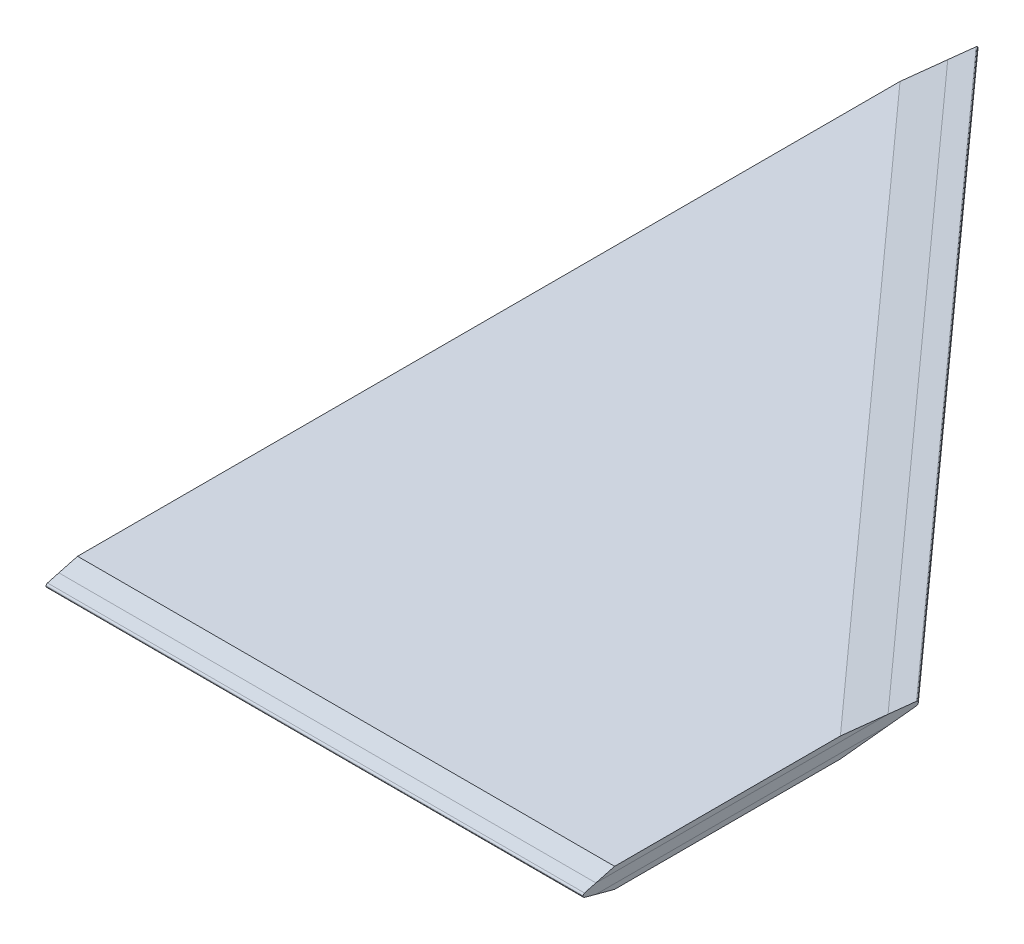
ISO-10303-21;
HEADER;
FILE_DESCRIPTION(('STEP AP214'),'2;1');
FILE_NAME('part.step','',(''),(''),'','','');
FILE_SCHEMA(('AUTOMOTIVE_DESIGN { 1 0 10303 214 1 1 1 1 }'));
ENDSEC;
DATA;
#1=APPLICATION_CONTEXT('core data for automotive mechanical design processes');
#2=APPLICATION_PROTOCOL_DEFINITION('international standard','automotive_design',2000,#1);
#3=PRODUCT_CONTEXT('',#1,'mechanical');
#4=PRODUCT('Part','Part','',(#3));
#5=PRODUCT_RELATED_PRODUCT_CATEGORY('part','',(#4));
#6=PRODUCT_DEFINITION_FORMATION('','',#4);
#7=PRODUCT_DEFINITION_CONTEXT('part definition',#1,'design');
#8=PRODUCT_DEFINITION('design','',#6,#7);
#9=PRODUCT_DEFINITION_SHAPE('','',#8);
#10=(LENGTH_UNIT() NAMED_UNIT(*) SI_UNIT(.MILLI.,.METRE.));
#11=(NAMED_UNIT(*) PLANE_ANGLE_UNIT() SI_UNIT($,.RADIAN.));
#12=(NAMED_UNIT(*) SI_UNIT($,.STERADIAN.) SOLID_ANGLE_UNIT());
#13=UNCERTAINTY_MEASURE_WITH_UNIT(LENGTH_MEASURE(1.E-05),#10,'distance_accuracy_value','');
#14=(GEOMETRIC_REPRESENTATION_CONTEXT(3) GLOBAL_UNCERTAINTY_ASSIGNED_CONTEXT((#13)) GLOBAL_UNIT_ASSIGNED_CONTEXT((#10,
#11,#12)) REPRESENTATION_CONTEXT('',''));
#15=CARTESIAN_POINT('',(0.,0.,0.));
#16=DIRECTION('',(0.,0.,1.));
#17=DIRECTION('',(1.,0.,0.));
#18=AXIS2_PLACEMENT_3D('',#15,#16,#17);
#19=CARTESIAN_POINT('',(171.45,1.4811576642539,-0.396875000000005));
#20=DIRECTION('',(0.,-0.965925826289068,0.258819045102523));
#21=DIRECTION('',(-1.,0.,0.));
#22=AXIS2_PLACEMENT_3D('',#19,#20,#21);
#23=PLANE('',#22);
#24=DIRECTION('',(0.,-0.258819045102523,-0.965925826289068));
#25=VECTOR('',#24,1.);
#26=CARTESIAN_POINT('',(0.,1.69384233574611,0.396875));
#27=LINE('',#26,#25);
#28=CARTESIAN_POINT('',(0.,0.974137100306443,-2.28910150513413));
#29=VERTEX_POINT('',#28);
#30=CARTESIAN_POINT('',(0.,0.,-5.92463065701555));
#31=VERTEX_POINT('',#30);
#32=EDGE_CURVE('P0_E126',#29,#31,#27,.T.);
#33=ORIENTED_EDGE('',*,*,#32,.T.);
#34=DIRECTION('',(-1.,0.,0.));
#35=VECTOR('',#34,1.);
#36=CARTESIAN_POINT('',(0.,0.,-5.92463065701556));
#37=LINE('',#36,#35);
#38=CARTESIAN_POINT('',(171.45,0.,-5.92463065701556));
#39=VERTEX_POINT('',#38);
#40=EDGE_CURVE('P0_E141',#39,#31,#37,.T.);
#41=ORIENTED_EDGE('',*,*,#40,.F.);
#42=DIRECTION('',(0.,0.258819045102523,0.965925826289068));
#43=VECTOR('',#42,1.);
#44=CARTESIAN_POINT('',(171.45,1.4811576642539,-0.396875000000005));
#45=LINE('',#44,#43);
#46=CARTESIAN_POINT('',(171.45,0.974137100306442,-2.28910150513413));
#47=VERTEX_POINT('',#46);
#48=EDGE_CURVE('P0_E154',#39,#47,#45,.T.);
#49=ORIENTED_EDGE('',*,*,#48,.T.);
#50=DIRECTION('',(-1.,0.,0.));
#51=VECTOR('',#50,1.);
#52=CARTESIAN_POINT('',(171.45,0.974137100306442,-2.28910150513413));
#53=LINE('',#52,#51);
#54=EDGE_CURVE('P0_E492',#47,#29,#53,.T.);
#55=ORIENTED_EDGE('',*,*,#54,.T.);
#56=EDGE_LOOP('',(#33,#41,#49,#55));
#57=FACE_BOUND('',#56,.T.);
#58=ADVANCED_FACE('P0_F17',(#57),#23,.T.);
#59=CARTESIAN_POINT('',(171.45,1.48115766425389,0.396875));
#60=DIRECTION('',(0.,0.965925826289068,0.258819045102523));
#61=DIRECTION('',(1.,0.,0.));
#62=AXIS2_PLACEMENT_3D('',#59,#60,#61);
#63=PLANE('',#62);
#64=DIRECTION('',(0.,-0.258819045102523,0.965925826289068));
#65=VECTOR('',#64,1.);
#66=CARTESIAN_POINT('',(0.,1.6938423357461,-0.396875));
#67=LINE('',#66,#65);
#68=CARTESIAN_POINT('',(0.,3.175,-5.92463065701556));
#69=VERTEX_POINT('',#68);
#70=CARTESIAN_POINT('',(0.,2.20086289969356,-2.28910150513413));
#71=VERTEX_POINT('',#70);
#72=EDGE_CURVE('P0_E157',#69,#71,#67,.T.);
#73=ORIENTED_EDGE('',*,*,#72,.T.);
#74=DIRECTION('',(-1.,0.,0.));
#75=VECTOR('',#74,1.);
#76=CARTESIAN_POINT('',(171.45,2.20086289969356,-2.28910150513413));
#77=LINE('',#76,#75);
#78=CARTESIAN_POINT('',(171.45,2.20086289969356,-2.28910150513413));
#79=VERTEX_POINT('',#78);
#80=EDGE_CURVE('P0_E11',#79,#71,#77,.T.);
#81=ORIENTED_EDGE('',*,*,#80,.F.);
#82=DIRECTION('',(0.,0.258819045102523,-0.965925826289068));
#83=VECTOR('',#82,1.);
#84=CARTESIAN_POINT('',(171.45,1.48115766425389,0.396875));
#85=LINE('',#84,#83);
#86=CARTESIAN_POINT('',(171.45,3.175,-5.92463065701556));
#87=VERTEX_POINT('',#86);
#88=EDGE_CURVE('P0_E137',#79,#87,#85,.T.);
#89=ORIENTED_EDGE('',*,*,#88,.T.);
#90=DIRECTION('',(-1.,0.,0.));
#91=VECTOR('',#90,1.);
#92=CARTESIAN_POINT('',(0.,3.175,-5.92463065701556));
#93=LINE('',#92,#91);
#94=EDGE_CURVE('P0_E522',#87,#69,#93,.T.);
#95=ORIENTED_EDGE('',*,*,#94,.T.);
#96=EDGE_LOOP('',(#73,#81,#89,#95));
#97=FACE_BOUND('',#96,.T.);
#98=ADVANCED_FACE('P0_F353',(#97),#63,.T.);
#99=CARTESIAN_POINT('',(171.45,1.5875,-2.45345159877422));
#100=DIRECTION('',(-1.,0.,0.));
#101=DIRECTION('',(0.,0.,1.));
#102=AXIS2_PLACEMENT_3D('',#99,#100,#101);
#103=CYLINDRICAL_SURFACE('',#102,0.635);
#104=DIRECTION('',(-1.,0.,0.));
#105=VECTOR('',#104,1.);
#106=CARTESIAN_POINT('',(171.45,1.5875,-1.81845159877423));
#107=LINE('',#106,#105);
#108=CARTESIAN_POINT('',(171.45,1.5875,-1.81845159877423));
#109=VERTEX_POINT('',#108);
#110=CARTESIAN_POINT('',(0.,1.5875,-1.81845159877423));
#111=VERTEX_POINT('',#110);
#112=EDGE_CURVE('P0_E498',#109,#111,#107,.T.);
#113=ORIENTED_EDGE('',*,*,#112,.F.);
#114=CARTESIAN_POINT('',(171.45,1.5875,-2.45345159877422));
#115=DIRECTION('',(1.,0.,0.));
#116=DIRECTION('',(0.,0.,1.));
#117=AXIS2_PLACEMENT_3D('',#114,#115,#116);
#118=CIRCLE('',#117,0.635);
#119=EDGE_CURVE('P0_E153',#79,#109,#118,.T.);
#120=ORIENTED_EDGE('',*,*,#119,.F.);
#121=ORIENTED_EDGE('',*,*,#80,.T.);
#122=CARTESIAN_POINT('',(0.,1.5875,-2.45345159877422));
#123=DIRECTION('',(-1.,0.,0.));
#124=DIRECTION('',(0.,0.,1.));
#125=AXIS2_PLACEMENT_3D('',#122,#123,#124);
#126=CIRCLE('',#125,0.635);
#127=EDGE_CURVE('P0_E165',#111,#71,#126,.T.);
#128=ORIENTED_EDGE('',*,*,#127,.F.);
#129=EDGE_LOOP('',(#113,#120,#121,#128));
#130=FACE_BOUND('',#129,.T.);
#131=ADVANCED_FACE('P0_F346',(#130),#103,.T.);
#132=CARTESIAN_POINT('',(213.203565959307,-30.1155870225421,233.727575322315));
#133=DIRECTION('',(-0.115367241229676,0.987881381223681,0.103830517106708));
#134=DIRECTION('',(0.66896473162245,0.,0.743294146247166));
#135=AXIS2_PLACEMENT_3D('',#132,#133,#134);
#136=PLANE('',#135);
#137=DIRECTION('',(-0.66896473162245,0.,-0.743294146247166));
#138=VECTOR('',#137,1.);
#139=CARTESIAN_POINT('',(144.047708169077,0.,-129.642937352169));
#140=LINE('',#139,#138);
#141=CARTESIAN_POINT('',(171.45,0.,-99.1959464289207));
#142=VERTEX_POINT('',#141);
#143=CARTESIAN_POINT('',(0.,0.,-289.69594642892));
#144=VERTEX_POINT('',#143);
#145=EDGE_CURVE('P0_E129',#142,#144,#140,.T.);
#146=ORIENTED_EDGE('',*,*,#145,.T.);
#147=DIRECTION('',(0.,-0.104528463267647,0.994521895368274));
#148=VECTOR('',#147,1.);
#149=CARTESIAN_POINT('',(0.,-30.080896338707,-3.49533555275418));
#150=LINE('',#149,#148);
#151=CARTESIAN_POINT('',(0.,0.955978596441139,-298.791475205899));
#152=VERTEX_POINT('',#151);
#153=EDGE_CURVE('P0_E115',#152,#144,#150,.T.);
#154=ORIENTED_EDGE('',*,*,#153,.F.);
#155=DIRECTION('',(-0.66896473162245,0.,-0.743294146247167));
#156=VECTOR('',#155,1.);
#157=CARTESIAN_POINT('',(213.203565959307,0.955978596441139,-61.8986241400018));
#158=LINE('',#157,#156);
#159=CARTESIAN_POINT('',(171.45,0.955978596441135,-108.291475205898));
#160=VERTEX_POINT('',#159);
#161=EDGE_CURVE('P0_E40',#160,#152,#158,.T.);
#162=ORIENTED_EDGE('',*,*,#161,.F.);
#163=DIRECTION('',(0.,0.104528463267647,-0.994521895368274));
#164=VECTOR('',#163,1.);
#165=CARTESIAN_POINT('',(171.45,1.60484534191754,-114.465029904587));
#166=LINE('',#165,#164);
#167=EDGE_CURVE('P0_E132',#142,#160,#166,.T.);
#168=ORIENTED_EDGE('',*,*,#167,.F.);
#169=EDGE_LOOP('',(#146,#154,#162,#168));
#170=FACE_BOUND('',#169,.T.);
#171=ADVANCED_FACE('P0_F130',(#170),#136,.F.);
#172=CARTESIAN_POINT('',(213.203565959307,33.255896338707,233.397515513143));
#173=DIRECTION('',(-0.115367241229676,-0.987881381223681,0.103830517106708));
#174=DIRECTION('',(-0.993249892050591,0.115994189257429,0.));
#175=AXIS2_PLACEMENT_3D('',#172,#173,#174);
#176=PLANE('',#175);
#177=DIRECTION('',(-0.66896473162245,0.,-0.743294146247167));
#178=VECTOR('',#177,1.);
#179=CARTESIAN_POINT('',(213.203565959307,2.21902140355886,-61.8986241400018));
#180=LINE('',#179,#178);
#181=CARTESIAN_POINT('',(171.45,2.21902140355886,-108.291475205898));
#182=VERTEX_POINT('',#181);
#183=CARTESIAN_POINT('',(0.,2.21902140355886,-298.791475205899));
#184=VERTEX_POINT('',#183);
#185=EDGE_CURVE('P0_E26',#182,#184,#180,.T.);
#186=ORIENTED_EDGE('',*,*,#185,.T.);
#187=DIRECTION('',(0.,-0.104528463267647,-0.994521895368274));
#188=VECTOR('',#187,1.);
#189=CARTESIAN_POINT('',(0.,33.2905870225421,-3.16527574358101));
#190=LINE('',#189,#188);
#191=CARTESIAN_POINT('',(0.,3.175,-289.69594642892));
#192=VERTEX_POINT('',#191);
#193=EDGE_CURVE('P0_E161',#192,#184,#190,.T.);
#194=ORIENTED_EDGE('',*,*,#193,.F.);
#195=DIRECTION('',(-0.66896473162245,0.,-0.743294146247166));
#196=VECTOR('',#195,1.);
#197=CARTESIAN_POINT('',(144.047708169077,3.175,-129.642937352169));
#198=LINE('',#197,#196);
#199=CARTESIAN_POINT('',(171.45,3.175,-99.1959464289206));
#200=VERTEX_POINT('',#199);
#201=EDGE_CURVE('P0_E519',#200,#192,#198,.T.);
#202=ORIENTED_EDGE('',*,*,#201,.F.);
#203=DIRECTION('',(0.,0.104528463267647,0.994521895368274));
#204=VECTOR('',#203,1.);
#205=CARTESIAN_POINT('',(171.45,1.60484534191754,-114.134970095413));
#206=LINE('',#205,#204);
#207=EDGE_CURVE('P0_E162',#182,#200,#206,.T.);
#208=ORIENTED_EDGE('',*,*,#207,.F.);
#209=EDGE_LOOP('',(#186,#194,#202,#208));
#210=FACE_BOUND('',#209,.T.);
#211=ADVANCED_FACE('P0_F186',(#210),#176,.F.);
#212=CARTESIAN_POINT('',(171.45,2.21902140355885,-108.291475205898));
#213=CARTESIAN_POINT('',(0.,2.21902140355885,-298.791475205899));
#214=CARTESIAN_POINT('',(171.45,2.10982561569183,-109.330403728533));
#215=CARTESIAN_POINT('',(0.,2.10982561569183,-299.830403728533));
#216=CARTESIAN_POINT('',(171.45,1.06517438430817,-109.330403728533));
#217=CARTESIAN_POINT('',(0.,1.06517438430817,-299.830403728533));
#218=CARTESIAN_POINT('',(171.45,0.955978596441143,-108.291475205898));
#219=CARTESIAN_POINT('',(0.,0.955978596441143,-298.791475205899));
#220=(BOUNDED_SURFACE() B_SPLINE_SURFACE(3,1,((#212,#213),(#214,#215),(#216,#217),(#218,#219)),
.UNSPECIFIED.,.F.,.F.,.F.) B_SPLINE_SURFACE_WITH_KNOTS((4,4),(2,2),(0.,1.),(0.,1.),
.UNSPECIFIED.) GEOMETRIC_REPRESENTATION_ITEM() RATIONAL_B_SPLINE_SURFACE(((1.,1.),
(0.403018975511658,0.403018975511658),(0.403018975511658,0.403018975511658),(1.,1.))) REPRESENTATION_ITEM('') SURFACE());
#221=CARTESIAN_POINT('',(171.45,2.21902140355885,-108.291475205898));
#222=CARTESIAN_POINT('',(171.45,2.10982561569183,-109.330403728533));
#223=CARTESIAN_POINT('',(171.45,1.06517438430817,-109.330403728533));
#224=CARTESIAN_POINT('',(171.45,0.955978596441143,-108.291475205898));
#225=(BOUNDED_CURVE() B_SPLINE_CURVE(3,(#221,#222,#223,#224),.UNSPECIFIED.,.F.,
.F.) B_SPLINE_CURVE_WITH_KNOTS((4,4),(0.,1.),
.UNSPECIFIED.) CURVE() GEOMETRIC_REPRESENTATION_ITEM() RATIONAL_B_SPLINE_CURVE((1.,
0.403018975511658,0.403018975511658,1.)) REPRESENTATION_ITEM(''));
#226=EDGE_CURVE('P0_E210',#182,#160,#225,.T.);
#227=CARTESIAN_POINT('',(0.,0.955978596441143,-298.791475205899));
#228=CARTESIAN_POINT('',(0.,1.06517438430817,-299.830403728533));
#229=CARTESIAN_POINT('',(0.,2.10982561569183,-299.830403728533));
#230=CARTESIAN_POINT('',(0.,2.21902140355885,-298.791475205899));
#231=(BOUNDED_CURVE() B_SPLINE_CURVE(3,(#227,#228,#229,#230),.UNSPECIFIED.,.F.,
.F.) B_SPLINE_CURVE_WITH_KNOTS((4,4),(0.,1.),
.UNSPECIFIED.) CURVE() GEOMETRIC_REPRESENTATION_ITEM() RATIONAL_B_SPLINE_CURVE((1.,
0.403018975511658,0.403018975511658,1.)) REPRESENTATION_ITEM(''));
#232=EDGE_CURVE('P0_E122',#152,#184,#231,.T.);
#233=ORIENTED_EDGE('',*,*,#226,.T.);
#234=ORIENTED_EDGE('',*,*,#161,.T.);
#235=ORIENTED_EDGE('',*,*,#232,.T.);
#236=ORIENTED_EDGE('',*,*,#185,.F.);
#237=EDGE_LOOP('',(#233,#234,#235,#236));
#238=FACE_BOUND('',#237,.T.);
#239=ADVANCED_FACE('P0_F174',(#238),#220,.T.);
#240=CARTESIAN_POINT('',(0.,3.175,0.));
#241=DIRECTION('',(1.,0.,0.));
#242=DIRECTION('',(0.,1.,0.));
#243=AXIS2_PLACEMENT_3D('',#240,#241,#242);
#244=PLANE('',#243);
#245=ORIENTED_EDGE('',*,*,#72,.F.);
#246=DIRECTION('',(0.,0.,1.));
#247=VECTOR('',#246,1.);
#248=CARTESIAN_POINT('',(0.,3.175,0.));
#249=LINE('',#248,#247);
#250=EDGE_CURVE('P0_E514',#192,#69,#249,.T.);
#251=ORIENTED_EDGE('',*,*,#250,.F.);
#252=ORIENTED_EDGE('',*,*,#193,.T.);
#253=ORIENTED_EDGE('',*,*,#232,.F.);
#254=ORIENTED_EDGE('',*,*,#153,.T.);
#255=DIRECTION('',(0.,0.,1.));
#256=VECTOR('',#255,1.);
#257=CARTESIAN_POINT('',(0.,0.,0.));
#258=LINE('',#257,#256);
#259=EDGE_CURVE('P0_E119',#144,#31,#258,.T.);
#260=ORIENTED_EDGE('',*,*,#259,.T.);
#261=ORIENTED_EDGE('',*,*,#32,.F.);
#262=CARTESIAN_POINT('',(0.,1.5875,-2.45345159877422));
#263=DIRECTION('',(-1.,0.,0.));
#264=DIRECTION('',(0.,0.,1.));
#265=AXIS2_PLACEMENT_3D('',#262,#263,#264);
#266=CIRCLE('',#265,0.635);
#267=EDGE_CURVE('P0_E495',#29,#111,#266,.T.);
#268=ORIENTED_EDGE('',*,*,#267,.T.);
#269=ORIENTED_EDGE('',*,*,#127,.T.);
#270=EDGE_LOOP('',(#245,#251,#252,#253,#254,#260,#261,#268,#269));
#271=FACE_BOUND('',#270,.T.);
#272=ADVANCED_FACE('P0_F117',(#271),#244,.F.);
#273=CARTESIAN_POINT('',(171.45,3.175,-114.3));
#274=DIRECTION('',(-1.,0.,0.));
#275=DIRECTION('',(0.,1.,0.));
#276=AXIS2_PLACEMENT_3D('',#273,#274,#275);
#277=PLANE('',#276);
#278=ORIENTED_EDGE('',*,*,#88,.F.);
#279=ORIENTED_EDGE('',*,*,#119,.T.);
#280=CARTESIAN_POINT('',(171.45,1.5875,-2.45345159877422));
#281=DIRECTION('',(1.,0.,0.));
#282=DIRECTION('',(0.,0.,1.));
#283=AXIS2_PLACEMENT_3D('',#280,#281,#282);
#284=CIRCLE('',#283,0.635);
#285=EDGE_CURVE('P0_E503',#109,#47,#284,.T.);
#286=ORIENTED_EDGE('',*,*,#285,.T.);
#287=ORIENTED_EDGE('',*,*,#48,.F.);
#288=DIRECTION('',(0.,0.,-1.));
#289=VECTOR('',#288,1.);
#290=CARTESIAN_POINT('',(171.45,0.,-114.3));
#291=LINE('',#290,#289);
#292=EDGE_CURVE('P0_E148',#39,#142,#291,.T.);
#293=ORIENTED_EDGE('',*,*,#292,.T.);
#294=ORIENTED_EDGE('',*,*,#167,.T.);
#295=ORIENTED_EDGE('',*,*,#226,.F.);
#296=ORIENTED_EDGE('',*,*,#207,.T.);
#297=DIRECTION('',(0.,0.,-1.));
#298=VECTOR('',#297,1.);
#299=CARTESIAN_POINT('',(171.45,3.175,-114.3));
#300=LINE('',#299,#298);
#301=EDGE_CURVE('P0_E526',#87,#200,#300,.T.);
#302=ORIENTED_EDGE('',*,*,#301,.F.);
#303=EDGE_LOOP('',(#278,#279,#286,#287,#293,#294,#295,#296,#302));
#304=FACE_BOUND('',#303,.T.);
#305=ADVANCED_FACE('P0_F216',(#304),#277,.F.);
#306=CARTESIAN_POINT('',(0.,0.,0.));
#307=DIRECTION('',(0.,-1.,0.));
#308=DIRECTION('',(0.,0.,-1.));
#309=AXIS2_PLACEMENT_3D('',#306,#307,#308);
#310=PLANE('',#309);
#311=ORIENTED_EDGE('',*,*,#292,.F.);
#312=ORIENTED_EDGE('',*,*,#40,.T.);
#313=ORIENTED_EDGE('',*,*,#259,.F.);
#314=ORIENTED_EDGE('',*,*,#145,.F.);
#315=EDGE_LOOP('',(#311,#312,#313,#314));
#316=FACE_BOUND('',#315,.T.);
#317=ADVANCED_FACE('P0_F139',(#316),#310,.T.);
#318=CARTESIAN_POINT('',(0.,3.175,0.));
#319=DIRECTION('',(0.,-1.,0.));
#320=DIRECTION('',(0.,0.,-1.));
#321=AXIS2_PLACEMENT_3D('',#318,#319,#320);
#322=PLANE('',#321);
#323=ORIENTED_EDGE('',*,*,#94,.F.);
#324=ORIENTED_EDGE('',*,*,#301,.T.);
#325=ORIENTED_EDGE('',*,*,#201,.T.);
#326=ORIENTED_EDGE('',*,*,#250,.T.);
#327=EDGE_LOOP('',(#323,#324,#325,#326));
#328=FACE_BOUND('',#327,.T.);
#329=ADVANCED_FACE('P0_F188',(#328),#322,.F.);
#330=CARTESIAN_POINT('',(171.45,1.5875,-2.45345159877422));
#331=DIRECTION('',(-1.,0.,0.));
#332=DIRECTION('',(0.,0.,1.));
#333=AXIS2_PLACEMENT_3D('',#330,#331,#332);
#334=CYLINDRICAL_SURFACE('',#333,0.635);
#335=ORIENTED_EDGE('',*,*,#285,.F.);
#336=ORIENTED_EDGE('',*,*,#112,.T.);
#337=ORIENTED_EDGE('',*,*,#267,.F.);
#338=ORIENTED_EDGE('',*,*,#54,.F.);
#339=EDGE_LOOP('',(#335,#336,#337,#338));
#340=FACE_BOUND('',#339,.T.);
#341=ADVANCED_FACE('P0_F187',(#340),#334,.T.);
#342=CLOSED_SHELL('',(#58,#98,#131,#171,#211,#239,#272,#305,#317,#329,#341));
#343=MANIFOLD_SOLID_BREP('P0_B1',#342);
#344=CARTESIAN_POINT('',(171.45,1.48115766425389,0.396875));
#345=DIRECTION('',(0.,0.965925826289068,0.258819045102523));
#346=DIRECTION('',(1.,0.,0.));
#347=AXIS2_PLACEMENT_3D('',#344,#345,#346);
#348=PLANE('',#347);
#349=DIRECTION('',(0.,-0.258819045102523,0.965925826289068));
#350=VECTOR('',#349,1.);
#351=CARTESIAN_POINT('',(0.,78.0010354101787,-285.179196536748));
#352=LINE('',#351,#350);
#353=CARTESIAN_POINT('',(-6.E-06,4.7752,-11.8966583592872));
#354=VERTEX_POINT('',#353);
#355=CARTESIAN_POINT('',(0.,3.175,-5.92463065701565));
#356=VERTEX_POINT('',#355);
#357=EDGE_CURVE('P1_E97',#354,#356,#352,.T.);
#358=ORIENTED_EDGE('',*,*,#357,.T.);
#359=DIRECTION('',(1.,0.,0.));
#360=VECTOR('',#359,1.);
#361=CARTESIAN_POINT('',(0.,3.175,-5.92463065701556));
#362=LINE('',#361,#360);
#363=CARTESIAN_POINT('',(171.45,3.175,-5.92463065701556));
#364=VERTEX_POINT('',#363);
#365=EDGE_CURVE('P1_E25',#356,#364,#362,.T.);
#366=ORIENTED_EDGE('',*,*,#365,.T.);
#367=DIRECTION('',(0.,0.258819045102523,-0.965925826289068));
#368=VECTOR('',#367,1.);
#369=CARTESIAN_POINT('',(171.45,1.48115766425389,0.396875));
#370=LINE('',#369,#368);
#371=CARTESIAN_POINT('',(171.45,4.7752,-11.8966583592872));
#372=VERTEX_POINT('',#371);
#373=EDGE_CURVE('P1_E85',#364,#372,#370,.T.);
#374=ORIENTED_EDGE('',*,*,#373,.T.);
#375=DIRECTION('',(-1.,0.,0.));
#376=VECTOR('',#375,1.);
#377=CARTESIAN_POINT('',(171.45,4.7752,-11.8966583592872));
#378=LINE('',#377,#376);
#379=EDGE_CURVE('P1_E101',#372,#354,#378,.T.);
#380=ORIENTED_EDGE('',*,*,#379,.T.);
#381=EDGE_LOOP('',(#358,#366,#374,#380));
#382=FACE_BOUND('',#381,.T.);
#383=ADVANCED_FACE('P1_F17',(#382),#348,.T.);
#384=CARTESIAN_POINT('',(213.203565959307,33.255896338707,233.397515513143));
#385=DIRECTION('',(-0.115367241229676,-0.987881381223681,0.103830517106708));
#386=DIRECTION('',(-0.993249892050591,0.115994189257429,0.));
#387=AXIS2_PLACEMENT_3D('',#384,#385,#386);
#388=PLANE('',#387);
#389=DIRECTION('',(-0.66896473162245,0.,-0.743294146247167));
#390=VECTOR('',#389,1.);
#391=CARTESIAN_POINT('',(213.203565959307,4.7752,-37.5782093633761));
#392=LINE('',#391,#390);
#393=CARTESIAN_POINT('',(171.45,4.7752,-83.9710604292726));
#394=VERTEX_POINT('',#393);
#395=CARTESIAN_POINT('',(0.,4.7752,-274.471060429272));
#396=VERTEX_POINT('',#395);
#397=EDGE_CURVE('P1_E38',#394,#396,#392,.T.);
#398=ORIENTED_EDGE('',*,*,#397,.F.);
#399=DIRECTION('',(0.,0.104528463267647,0.994521895368274));
#400=VECTOR('',#399,1.);
#401=CARTESIAN_POINT('',(171.45,13.5044825768046,-0.917484569652984));
#402=LINE('',#401,#400);
#403=CARTESIAN_POINT('',(171.45,3.175,-99.1959464289206));
#404=VERTEX_POINT('',#403);
#405=EDGE_CURVE('P1_E76',#404,#394,#402,.T.);
#406=ORIENTED_EDGE('',*,*,#405,.F.);
#407=DIRECTION('',(0.66896473162245,0.,0.743294146247166));
#408=VECTOR('',#407,1.);
#409=CARTESIAN_POINT('',(144.047708169077,3.175,-129.642937352169));
#410=LINE('',#409,#408);
#411=CARTESIAN_POINT('',(0.,3.175,-289.69594642892));
#412=VERTEX_POINT('',#411);
#413=EDGE_CURVE('P1_E11',#412,#404,#410,.T.);
#414=ORIENTED_EDGE('',*,*,#413,.F.);
#415=DIRECTION('',(0.,-0.104528463267647,-0.994521895368274));
#416=VECTOR('',#415,1.);
#417=CARTESIAN_POINT('',(0.,1.62232944657041,-304.46861995159));
#418=LINE('',#417,#416);
#419=EDGE_CURVE('P1_E73',#396,#412,#418,.T.);
#420=ORIENTED_EDGE('',*,*,#419,.F.);
#421=EDGE_LOOP('',(#398,#406,#414,#420));
#422=FACE_BOUND('',#421,.T.);
#423=ADVANCED_FACE('P1_F71',(#422),#388,.F.);
#424=CARTESIAN_POINT('',(0.,3.175,0.));
#425=DIRECTION('',(0.,1.,0.));
#426=DIRECTION('',(1.,0.,0.));
#427=AXIS2_PLACEMENT_3D('',#424,#425,#426);
#428=PLANE('',#427);
#429=ORIENTED_EDGE('',*,*,#365,.F.);
#430=DIRECTION('',(0.,0.,1.));
#431=VECTOR('',#430,1.);
#432=CARTESIAN_POINT('',(0.,3.175,-304.8));
#433=LINE('',#432,#431);
#434=EDGE_CURVE('P1_E79',#412,#356,#433,.T.);
#435=ORIENTED_EDGE('',*,*,#434,.F.);
#436=ORIENTED_EDGE('',*,*,#413,.T.);
#437=DIRECTION('',(0.,0.,-1.));
#438=VECTOR('',#437,1.);
#439=CARTESIAN_POINT('',(171.45,3.175,0.));
#440=LINE('',#439,#438);
#441=EDGE_CURVE('P1_E109',#364,#404,#440,.T.);
#442=ORIENTED_EDGE('',*,*,#441,.F.);
#443=EDGE_LOOP('',(#429,#435,#436,#442));
#444=FACE_BOUND('',#443,.T.);
#445=ADVANCED_FACE('P1_F80',(#444),#428,.F.);
#446=CARTESIAN_POINT('',(0.,4.7752,0.));
#447=DIRECTION('',(0.,1.,0.));
#448=DIRECTION('',(1.,0.,0.));
#449=AXIS2_PLACEMENT_3D('',#446,#447,#448);
#450=PLANE('',#449);
#451=DIRECTION('',(0.,0.,1.));
#452=VECTOR('',#451,1.);
#453=CARTESIAN_POINT('',(0.,4.7752,-304.8));
#454=LINE('',#453,#452);
#455=EDGE_CURVE('P1_E89',#396,#354,#454,.T.);
#456=ORIENTED_EDGE('',*,*,#455,.T.);
#457=ORIENTED_EDGE('',*,*,#379,.F.);
#458=DIRECTION('',(0.,0.,-1.));
#459=VECTOR('',#458,1.);
#460=CARTESIAN_POINT('',(171.45,4.7752,0.));
#461=LINE('',#460,#459);
#462=EDGE_CURVE('P1_E102',#372,#394,#461,.T.);
#463=ORIENTED_EDGE('',*,*,#462,.T.);
#464=ORIENTED_EDGE('',*,*,#397,.T.);
#465=EDGE_LOOP('',(#456,#457,#463,#464));
#466=FACE_BOUND('',#465,.T.);
#467=ADVANCED_FACE('P1_F122',(#466),#450,.T.);
#468=CARTESIAN_POINT('',(171.45,4.7752,0.));
#469=DIRECTION('',(-1.,0.,0.));
#470=DIRECTION('',(0.,1.,0.));
#471=AXIS2_PLACEMENT_3D('',#468,#469,#470);
#472=PLANE('',#471);
#473=ORIENTED_EDGE('',*,*,#373,.F.);
#474=ORIENTED_EDGE('',*,*,#441,.T.);
#475=ORIENTED_EDGE('',*,*,#405,.T.);
#476=ORIENTED_EDGE('',*,*,#462,.F.);
#477=EDGE_LOOP('',(#473,#474,#475,#476));
#478=FACE_BOUND('',#477,.T.);
#479=ADVANCED_FACE('P1_F120',(#478),#472,.F.);
#480=CARTESIAN_POINT('',(0.,4.7752,-304.8));
#481=DIRECTION('',(1.,0.,0.));
#482=DIRECTION('',(0.,1.,0.));
#483=AXIS2_PLACEMENT_3D('',#480,#481,#482);
#484=PLANE('',#483);
#485=ORIENTED_EDGE('',*,*,#357,.F.);
#486=ORIENTED_EDGE('',*,*,#455,.F.);
#487=ORIENTED_EDGE('',*,*,#419,.T.);
#488=ORIENTED_EDGE('',*,*,#434,.T.);
#489=EDGE_LOOP('',(#485,#486,#487,#488));
#490=FACE_BOUND('',#489,.T.);
#491=ADVANCED_FACE('P1_F87',(#490),#484,.F.);
#492=CLOSED_SHELL('',(#383,#423,#445,#467,#479,#491));
#493=MANIFOLD_SOLID_BREP('P1_B1',#492);
#494=CARTESIAN_POINT('',(171.45,1.4811576642539,-0.396875000000005));
#495=DIRECTION('',(0.,-0.965925826289068,0.258819045102523));
#496=DIRECTION('',(-1.,0.,0.));
#497=AXIS2_PLACEMENT_3D('',#494,#495,#496);
#498=PLANE('',#497);
#499=DIRECTION('',(0.,-0.258819045102523,-0.965925826289068));
#500=VECTOR('',#499,1.);
#501=CARTESIAN_POINT('',(0.,-74.8260354101788,-285.179196536748));
#502=LINE('',#501,#500);
#503=CARTESIAN_POINT('',(0.,0.,-5.92463065701556));
#504=VERTEX_POINT('',#503);
#505=CARTESIAN_POINT('',(-6.E-06,-1.6002,-11.8966583592872));
#506=VERTEX_POINT('',#505);
#507=EDGE_CURVE('P2_E72',#504,#506,#502,.T.);
#508=ORIENTED_EDGE('',*,*,#507,.T.);
#509=DIRECTION('',(-1.,0.,0.));
#510=VECTOR('',#509,1.);
#511=CARTESIAN_POINT('',(171.45,-1.6002,-11.8966583592872));
#512=LINE('',#511,#510);
#513=CARTESIAN_POINT('',(171.45,-1.6002,-11.8966583592872));
#514=VERTEX_POINT('',#513);
#515=EDGE_CURVE('P2_E67',#514,#506,#512,.T.);
#516=ORIENTED_EDGE('',*,*,#515,.F.);
#517=DIRECTION('',(0.,0.258819045102523,0.965925826289068));
#518=VECTOR('',#517,1.);
#519=CARTESIAN_POINT('',(171.45,1.4811576642539,-0.396875000000005));
#520=LINE('',#519,#518);
#521=CARTESIAN_POINT('',(171.45,0.,-5.92463065701556));
#522=VERTEX_POINT('',#521);
#523=EDGE_CURVE('P2_E70',#514,#522,#520,.T.);
#524=ORIENTED_EDGE('',*,*,#523,.T.);
#525=DIRECTION('',(-1.,0.,0.));
#526=VECTOR('',#525,1.);
#527=CARTESIAN_POINT('',(0.,0.,-5.92463065701556));
#528=LINE('',#527,#526);
#529=EDGE_CURVE('P2_E19',#522,#504,#528,.T.);
#530=ORIENTED_EDGE('',*,*,#529,.T.);
#531=EDGE_LOOP('',(#508,#516,#524,#530));
#532=FACE_BOUND('',#531,.T.);
#533=ADVANCED_FACE('P2_F16',(#532),#498,.T.);
#534=CARTESIAN_POINT('',(213.203565959307,-30.1155870225421,233.727575322315));
#535=DIRECTION('',(-0.115367241229676,0.987881381223681,0.103830517106708));
#536=DIRECTION('',(0.66896473162245,0.,0.743294146247166));
#537=AXIS2_PLACEMENT_3D('',#534,#535,#536);
#538=PLANE('',#537);
#539=DIRECTION('',(-0.66896473162245,0.,-0.743294146247166));
#540=VECTOR('',#539,1.);
#541=CARTESIAN_POINT('',(144.047708169077,0.,-129.642937352169));
#542=LINE('',#541,#540);
#543=CARTESIAN_POINT('',(171.45,0.,-99.1959464289206));
#544=VERTEX_POINT('',#543);
#545=CARTESIAN_POINT('',(0.,0.,-289.69594642892));
#546=VERTEX_POINT('',#545);
#547=EDGE_CURVE('P2_E10',#544,#546,#542,.T.);
#548=ORIENTED_EDGE('',*,*,#547,.F.);
#549=DIRECTION('',(0.,0.104528463267647,-0.994521895368274));
#550=VECTOR('',#549,1.);
#551=CARTESIAN_POINT('',(171.45,-10.3294825768046,-0.917484569652984));
#552=LINE('',#551,#550);
#553=CARTESIAN_POINT('',(171.45,-1.6002,-83.9710604292726));
#554=VERTEX_POINT('',#553);
#555=EDGE_CURVE('P2_E86',#554,#544,#552,.T.);
#556=ORIENTED_EDGE('',*,*,#555,.F.);
#557=DIRECTION('',(-0.66896473162245,0.,-0.743294146247167));
#558=VECTOR('',#557,1.);
#559=CARTESIAN_POINT('',(213.203565959307,-1.6002,-37.5782093633761));
#560=LINE('',#559,#558);
#561=CARTESIAN_POINT('',(0.,-1.6002,-274.471060429272));
#562=VERTEX_POINT('',#561);
#563=EDGE_CURVE('P2_E77',#554,#562,#560,.T.);
#564=ORIENTED_EDGE('',*,*,#563,.T.);
#565=DIRECTION('',(0.,-0.104528463267647,0.994521895368274));
#566=VECTOR('',#565,1.);
#567=CARTESIAN_POINT('',(0.,1.55267055342959,-304.46861995159));
#568=LINE('',#567,#566);
#569=EDGE_CURVE('P2_E96',#546,#562,#568,.T.);
#570=ORIENTED_EDGE('',*,*,#569,.F.);
#571=EDGE_LOOP('',(#548,#556,#564,#570));
#572=FACE_BOUND('',#571,.T.);
#573=ADVANCED_FACE('P2_F110',(#572),#538,.F.);
#574=CARTESIAN_POINT('',(0.,0.,0.));
#575=DIRECTION('',(0.,-1.,0.));
#576=DIRECTION('',(0.,0.,-1.));
#577=AXIS2_PLACEMENT_3D('',#574,#575,#576);
#578=PLANE('',#577);
#579=ORIENTED_EDGE('',*,*,#529,.F.);
#580=DIRECTION('',(0.,0.,-1.));
#581=VECTOR('',#580,1.);
#582=CARTESIAN_POINT('',(171.45,0.,0.));
#583=LINE('',#582,#581);
#584=EDGE_CURVE('P2_E78',#522,#544,#583,.T.);
#585=ORIENTED_EDGE('',*,*,#584,.T.);
#586=ORIENTED_EDGE('',*,*,#547,.T.);
#587=DIRECTION('',(0.,0.,1.));
#588=VECTOR('',#587,1.);
#589=CARTESIAN_POINT('',(0.,0.,-304.8));
#590=LINE('',#589,#588);
#591=EDGE_CURVE('P2_E115',#546,#504,#590,.T.);
#592=ORIENTED_EDGE('',*,*,#591,.T.);
#593=EDGE_LOOP('',(#579,#585,#586,#592));
#594=FACE_BOUND('',#593,.T.);
#595=ADVANCED_FACE('P2_F108',(#594),#578,.F.);
#596=CARTESIAN_POINT('',(0.,-1.6002,0.));
#597=DIRECTION('',(0.,-1.,0.));
#598=DIRECTION('',(0.,0.,-1.));
#599=AXIS2_PLACEMENT_3D('',#596,#597,#598);
#600=PLANE('',#599);
#601=DIRECTION('',(0.,0.,-1.));
#602=VECTOR('',#601,1.);
#603=CARTESIAN_POINT('',(171.45,-1.6002,0.));
#604=LINE('',#603,#602);
#605=EDGE_CURVE('P2_E81',#514,#554,#604,.T.);
#606=ORIENTED_EDGE('',*,*,#605,.F.);
#607=ORIENTED_EDGE('',*,*,#515,.T.);
#608=DIRECTION('',(0.,0.,1.));
#609=VECTOR('',#608,1.);
#610=CARTESIAN_POINT('',(0.,-1.6002,-304.8));
#611=LINE('',#610,#609);
#612=EDGE_CURVE('P2_E91',#562,#506,#611,.T.);
#613=ORIENTED_EDGE('',*,*,#612,.F.);
#614=ORIENTED_EDGE('',*,*,#563,.F.);
#615=EDGE_LOOP('',(#606,#607,#613,#614));
#616=FACE_BOUND('',#615,.T.);
#617=ADVANCED_FACE('P2_F82',(#616),#600,.T.);
#618=CARTESIAN_POINT('',(171.45,-1.6002,0.));
#619=DIRECTION('',(-1.,0.,0.));
#620=DIRECTION('',(0.,1.,0.));
#621=AXIS2_PLACEMENT_3D('',#618,#619,#620);
#622=PLANE('',#621);
#623=ORIENTED_EDGE('',*,*,#523,.F.);
#624=ORIENTED_EDGE('',*,*,#605,.T.);
#625=ORIENTED_EDGE('',*,*,#555,.T.);
#626=ORIENTED_EDGE('',*,*,#584,.F.);
#627=EDGE_LOOP('',(#623,#624,#625,#626));
#628=FACE_BOUND('',#627,.T.);
#629=ADVANCED_FACE('P2_F89',(#628),#622,.F.);
#630=CARTESIAN_POINT('',(0.,-1.6002,-304.8));
#631=DIRECTION('',(1.,0.,0.));
#632=DIRECTION('',(0.,1.,0.));
#633=AXIS2_PLACEMENT_3D('',#630,#631,#632);
#634=PLANE('',#633);
#635=ORIENTED_EDGE('',*,*,#507,.F.);
#636=ORIENTED_EDGE('',*,*,#591,.F.);
#637=ORIENTED_EDGE('',*,*,#569,.T.);
#638=ORIENTED_EDGE('',*,*,#612,.T.);
#639=EDGE_LOOP('',(#635,#636,#637,#638));
#640=FACE_BOUND('',#639,.T.);
#641=ADVANCED_FACE('P2_F114',(#640),#634,.F.);
#642=CLOSED_SHELL('',(#533,#573,#595,#617,#629,#641));
#643=MANIFOLD_SOLID_BREP('P2_B1',#642);
#644=ADVANCED_BREP_SHAPE_REPRESENTATION('',(#18,#343,#493,#643),#14);
#645=SHAPE_DEFINITION_REPRESENTATION(#9,#644);
ENDSEC;
END-ISO-10303-21;
